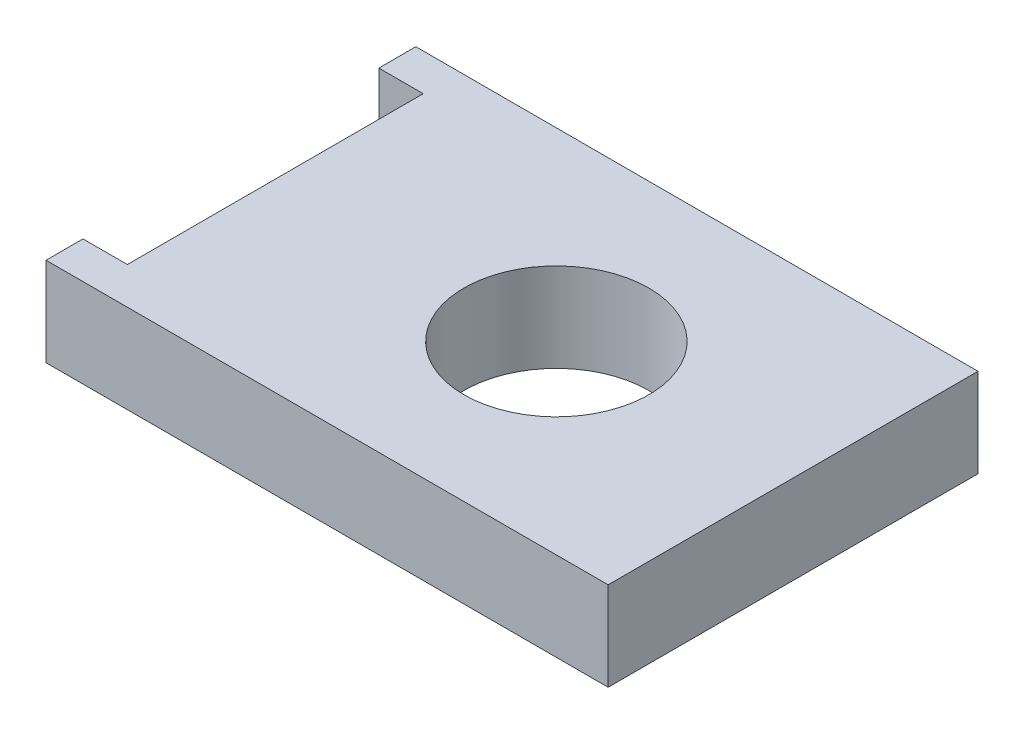
ISO-10303-21;
HEADER;
FILE_DESCRIPTION(('STEP AP214'),'2;1');
FILE_NAME('part.step','',(''),(''),'','','');
FILE_SCHEMA(('AUTOMOTIVE_DESIGN { 1 0 10303 214 1 1 1 1 }'));
ENDSEC;
DATA;
#1=APPLICATION_CONTEXT('core data for automotive mechanical design processes');
#2=APPLICATION_PROTOCOL_DEFINITION('international standard','automotive_design',2000,#1);
#3=PRODUCT_CONTEXT('',#1,'mechanical');
#4=PRODUCT('Part','Part','',(#3));
#5=PRODUCT_RELATED_PRODUCT_CATEGORY('part','',(#4));
#6=PRODUCT_DEFINITION_FORMATION('','',#4);
#7=PRODUCT_DEFINITION_CONTEXT('part definition',#1,'design');
#8=PRODUCT_DEFINITION('design','',#6,#7);
#9=PRODUCT_DEFINITION_SHAPE('','',#8);
#10=(LENGTH_UNIT() NAMED_UNIT(*) SI_UNIT(.MILLI.,.METRE.));
#11=(NAMED_UNIT(*) PLANE_ANGLE_UNIT() SI_UNIT($,.RADIAN.));
#12=(NAMED_UNIT(*) SI_UNIT($,.STERADIAN.) SOLID_ANGLE_UNIT());
#13=UNCERTAINTY_MEASURE_WITH_UNIT(LENGTH_MEASURE(1.E-05),#10,'distance_accuracy_value','');
#14=(GEOMETRIC_REPRESENTATION_CONTEXT(3) GLOBAL_UNCERTAINTY_ASSIGNED_CONTEXT((#13)) GLOBAL_UNIT_ASSIGNED_CONTEXT((#10,
#11,#12)) REPRESENTATION_CONTEXT('',''));
#15=CARTESIAN_POINT('',(0.,0.,0.));
#16=DIRECTION('',(0.,0.,1.));
#17=DIRECTION('',(1.,0.,0.));
#18=AXIS2_PLACEMENT_3D('',#15,#16,#17);
#19=CARTESIAN_POINT('',(0.,3.,0.));
#20=DIRECTION('',(0.,1.,0.));
#21=DIRECTION('',(0.,0.,1.));
#22=AXIS2_PLACEMENT_3D('',#19,#20,#21);
#23=PLANE('',#22);
#24=DIRECTION('',(0.,0.,1.));
#25=VECTOR('',#24,1.);
#26=CARTESIAN_POINT('',(-19.,3.,-10.));
#27=LINE('',#26,#25);
#28=CARTESIAN_POINT('',(-19.,3.,-12.5));
#29=VERTEX_POINT('',#28);
#30=CARTESIAN_POINT('',(-19.,3.,-10.));
#31=VERTEX_POINT('',#30);
#32=EDGE_CURVE('E170',#29,#31,#27,.T.);
#33=ORIENTED_EDGE('',*,*,#32,.T.);
#34=DIRECTION('',(1.,0.,0.));
#35=VECTOR('',#34,1.);
#36=CARTESIAN_POINT('',(-19.,3.,-10.));
#37=LINE('',#36,#35);
#38=CARTESIAN_POINT('',(-16.,3.,-10.));
#39=VERTEX_POINT('',#38);
#40=EDGE_CURVE('E106',#31,#39,#37,.T.);
#41=ORIENTED_EDGE('',*,*,#40,.T.);
#42=DIRECTION('',(0.,0.,1.));
#43=VECTOR('',#42,1.);
#44=CARTESIAN_POINT('',(-16.,3.,-10.));
#45=LINE('',#44,#43);
#46=CARTESIAN_POINT('',(-16.,3.,9.99999999999999));
#47=VERTEX_POINT('',#46);
#48=EDGE_CURVE('E191',#39,#47,#45,.T.);
#49=ORIENTED_EDGE('',*,*,#48,.T.);
#50=DIRECTION('',(-1.,0.,0.));
#51=VECTOR('',#50,1.);
#52=CARTESIAN_POINT('',(-16.,3.,9.99999999999999));
#53=LINE('',#52,#51);
#54=CARTESIAN_POINT('',(-19.,3.,9.99999999999999));
#55=VERTEX_POINT('',#54);
#56=EDGE_CURVE('E205',#47,#55,#53,.T.);
#57=ORIENTED_EDGE('',*,*,#56,.T.);
#58=DIRECTION('',(0.,0.,1.));
#59=VECTOR('',#58,1.);
#60=CARTESIAN_POINT('',(-19.,3.,12.5));
#61=LINE('',#60,#59);
#62=CARTESIAN_POINT('',(-19.,3.,12.5));
#63=VERTEX_POINT('',#62);
#64=EDGE_CURVE('E125',#55,#63,#61,.T.);
#65=ORIENTED_EDGE('',*,*,#64,.T.);
#66=DIRECTION('',(1.,0.,0.));
#67=VECTOR('',#66,1.);
#68=CARTESIAN_POINT('',(19.,3.,12.5));
#69=LINE('',#68,#67);
#70=CARTESIAN_POINT('',(19.,3.,12.5));
#71=VERTEX_POINT('',#70);
#72=EDGE_CURVE('E119',#63,#71,#69,.T.);
#73=ORIENTED_EDGE('',*,*,#72,.T.);
#74=DIRECTION('',(0.,0.,-1.));
#75=VECTOR('',#74,1.);
#76=CARTESIAN_POINT('',(19.,3.,12.5));
#77=LINE('',#76,#75);
#78=CARTESIAN_POINT('',(19.,3.,-12.5));
#79=VERTEX_POINT('',#78);
#80=EDGE_CURVE('E123',#71,#79,#77,.T.);
#81=ORIENTED_EDGE('',*,*,#80,.T.);
#82=DIRECTION('',(-1.,0.,0.));
#83=VECTOR('',#82,1.);
#84=CARTESIAN_POINT('',(19.,3.,-12.5));
#85=LINE('',#84,#83);
#86=EDGE_CURVE('E63',#79,#29,#85,.T.);
#87=ORIENTED_EDGE('',*,*,#86,.T.);
#88=EDGE_LOOP('',(#33,#41,#49,#57,#65,#73,#81,#87));
#89=FACE_BOUND('',#88,.T.);
#90=CARTESIAN_POINT('',(3.,3.,0.));
#91=DIRECTION('',(0.,1.,0.));
#92=DIRECTION('',(0.,0.,1.));
#93=AXIS2_PLACEMENT_3D('',#90,#91,#92);
#94=CIRCLE('',#93,6.25);
#95=CARTESIAN_POINT('',(3.,3.,6.24999999999999));
#96=VERTEX_POINT('',#95);
#97=EDGE_CURVE('E152',#96,#96,#94,.T.);
#98=ORIENTED_EDGE('',*,*,#97,.F.);
#99=EDGE_LOOP('',(#98));
#100=FACE_BOUND('',#99,.T.);
#101=ADVANCED_FACE('F45',(#89,#100),#23,.T.);
#102=CARTESIAN_POINT('',(0.,-3.,0.));
#103=DIRECTION('',(0.,1.,0.));
#104=DIRECTION('',(0.,0.,1.));
#105=AXIS2_PLACEMENT_3D('',#102,#103,#104);
#106=PLANE('',#105);
#107=DIRECTION('',(0.,0.,1.));
#108=VECTOR('',#107,1.);
#109=CARTESIAN_POINT('',(-19.,-3.,-10.));
#110=LINE('',#109,#108);
#111=CARTESIAN_POINT('',(-19.,-3.,-12.5));
#112=VERTEX_POINT('',#111);
#113=CARTESIAN_POINT('',(-19.,-3.,-10.));
#114=VERTEX_POINT('',#113);
#115=EDGE_CURVE('E147',#112,#114,#110,.T.);
#116=ORIENTED_EDGE('',*,*,#115,.F.);
#117=DIRECTION('',(-1.,0.,0.));
#118=VECTOR('',#117,1.);
#119=CARTESIAN_POINT('',(19.,-3.,-12.5));
#120=LINE('',#119,#118);
#121=CARTESIAN_POINT('',(19.,-3.,-12.5));
#122=VERTEX_POINT('',#121);
#123=EDGE_CURVE('E98',#122,#112,#120,.T.);
#124=ORIENTED_EDGE('',*,*,#123,.F.);
#125=DIRECTION('',(0.,0.,-1.));
#126=VECTOR('',#125,1.);
#127=CARTESIAN_POINT('',(19.,-3.,12.5));
#128=LINE('',#127,#126);
#129=CARTESIAN_POINT('',(19.,-3.,12.5));
#130=VERTEX_POINT('',#129);
#131=EDGE_CURVE('E92',#130,#122,#128,.T.);
#132=ORIENTED_EDGE('',*,*,#131,.F.);
#133=DIRECTION('',(1.,0.,0.));
#134=VECTOR('',#133,1.);
#135=CARTESIAN_POINT('',(19.,-3.,12.5));
#136=LINE('',#135,#134);
#137=CARTESIAN_POINT('',(-19.,-3.,12.5));
#138=VERTEX_POINT('',#137);
#139=EDGE_CURVE('E134',#138,#130,#136,.T.);
#140=ORIENTED_EDGE('',*,*,#139,.F.);
#141=DIRECTION('',(0.,0.,1.));
#142=VECTOR('',#141,1.);
#143=CARTESIAN_POINT('',(-19.,-3.,12.5));
#144=LINE('',#143,#142);
#145=CARTESIAN_POINT('',(-19.,-3.,9.99999999999999));
#146=VERTEX_POINT('',#145);
#147=EDGE_CURVE('E161',#146,#138,#144,.T.);
#148=ORIENTED_EDGE('',*,*,#147,.F.);
#149=DIRECTION('',(-1.,0.,0.));
#150=VECTOR('',#149,1.);
#151=CARTESIAN_POINT('',(-16.,-3.,9.99999999999999));
#152=LINE('',#151,#150);
#153=CARTESIAN_POINT('',(-16.,-3.,9.99999999999999));
#154=VERTEX_POINT('',#153);
#155=EDGE_CURVE('E158',#154,#146,#152,.T.);
#156=ORIENTED_EDGE('',*,*,#155,.F.);
#157=DIRECTION('',(0.,0.,1.));
#158=VECTOR('',#157,1.);
#159=CARTESIAN_POINT('',(-16.,-3.,-10.));
#160=LINE('',#159,#158);
#161=CARTESIAN_POINT('',(-16.,-3.,-10.));
#162=VERTEX_POINT('',#161);
#163=EDGE_CURVE('E155',#162,#154,#160,.T.);
#164=ORIENTED_EDGE('',*,*,#163,.F.);
#165=DIRECTION('',(1.,0.,0.));
#166=VECTOR('',#165,1.);
#167=CARTESIAN_POINT('',(-19.,-3.,-10.));
#168=LINE('',#167,#166);
#169=EDGE_CURVE('E151',#114,#162,#168,.T.);
#170=ORIENTED_EDGE('',*,*,#169,.F.);
#171=EDGE_LOOP('',(#116,#124,#132,#140,#148,#156,#164,#170));
#172=FACE_BOUND('',#171,.T.);
#173=CARTESIAN_POINT('',(3.,-3.,0.));
#174=DIRECTION('',(0.,1.,0.));
#175=DIRECTION('',(0.,0.,1.));
#176=AXIS2_PLACEMENT_3D('',#173,#174,#175);
#177=CIRCLE('',#176,6.25);
#178=CARTESIAN_POINT('',(3.,-3.,6.24999999999999));
#179=VERTEX_POINT('',#178);
#180=EDGE_CURVE('E215',#179,#179,#177,.T.);
#181=ORIENTED_EDGE('',*,*,#180,.T.);
#182=EDGE_LOOP('',(#181));
#183=FACE_BOUND('',#182,.T.);
#184=ADVANCED_FACE('F195',(#172,#183),#106,.F.);
#185=CARTESIAN_POINT('',(-19.,3.,-10.));
#186=DIRECTION('',(1.,0.,0.));
#187=DIRECTION('',(0.,0.,-1.));
#188=AXIS2_PLACEMENT_3D('',#185,#186,#187);
#189=PLANE('',#188);
#190=ORIENTED_EDGE('',*,*,#115,.T.);
#191=DIRECTION('',(0.,-1.,0.));
#192=VECTOR('',#191,1.);
#193=CARTESIAN_POINT('',(-19.,3.,-10.));
#194=LINE('',#193,#192);
#195=EDGE_CURVE('E11',#31,#114,#194,.T.);
#196=ORIENTED_EDGE('',*,*,#195,.F.);
#197=ORIENTED_EDGE('',*,*,#32,.F.);
#198=DIRECTION('',(0.,-1.,0.));
#199=VECTOR('',#198,1.);
#200=CARTESIAN_POINT('',(-19.,3.,-12.5));
#201=LINE('',#200,#199);
#202=EDGE_CURVE('E143',#29,#112,#201,.T.);
#203=ORIENTED_EDGE('',*,*,#202,.T.);
#204=EDGE_LOOP('',(#190,#196,#197,#203));
#205=FACE_BOUND('',#204,.T.);
#206=ADVANCED_FACE('F47',(#205),#189,.F.);
#207=CARTESIAN_POINT('',(-19.,3.,-10.));
#208=DIRECTION('',(0.,0.,-1.));
#209=DIRECTION('',(-1.,0.,0.));
#210=AXIS2_PLACEMENT_3D('',#207,#208,#209);
#211=PLANE('',#210);
#212=ORIENTED_EDGE('',*,*,#169,.T.);
#213=DIRECTION('',(0.,-1.,0.));
#214=VECTOR('',#213,1.);
#215=CARTESIAN_POINT('',(-16.,3.,-10.));
#216=LINE('',#215,#214);
#217=EDGE_CURVE('E55',#39,#162,#216,.T.);
#218=ORIENTED_EDGE('',*,*,#217,.F.);
#219=ORIENTED_EDGE('',*,*,#40,.F.);
#220=ORIENTED_EDGE('',*,*,#195,.T.);
#221=EDGE_LOOP('',(#212,#218,#219,#220));
#222=FACE_BOUND('',#221,.T.);
#223=ADVANCED_FACE('F245',(#222),#211,.F.);
#224=CARTESIAN_POINT('',(-16.,3.,-10.));
#225=DIRECTION('',(1.,0.,0.));
#226=DIRECTION('',(0.,0.,-1.));
#227=AXIS2_PLACEMENT_3D('',#224,#225,#226);
#228=PLANE('',#227);
#229=ORIENTED_EDGE('',*,*,#163,.T.);
#230=DIRECTION('',(0.,-1.,0.));
#231=VECTOR('',#230,1.);
#232=CARTESIAN_POINT('',(-16.,3.,9.99999999999999));
#233=LINE('',#232,#231);
#234=EDGE_CURVE('E181',#47,#154,#233,.T.);
#235=ORIENTED_EDGE('',*,*,#234,.F.);
#236=ORIENTED_EDGE('',*,*,#48,.F.);
#237=ORIENTED_EDGE('',*,*,#217,.T.);
#238=EDGE_LOOP('',(#229,#235,#236,#237));
#239=FACE_BOUND('',#238,.T.);
#240=ADVANCED_FACE('F189',(#239),#228,.F.);
#241=CARTESIAN_POINT('',(-16.,3.,9.99999999999999));
#242=DIRECTION('',(0.,0.,1.));
#243=DIRECTION('',(1.,0.,0.));
#244=AXIS2_PLACEMENT_3D('',#241,#242,#243);
#245=PLANE('',#244);
#246=ORIENTED_EDGE('',*,*,#155,.T.);
#247=DIRECTION('',(0.,-1.,0.));
#248=VECTOR('',#247,1.);
#249=CARTESIAN_POINT('',(-19.,3.,9.99999999999999));
#250=LINE('',#249,#248);
#251=EDGE_CURVE('E177',#55,#146,#250,.T.);
#252=ORIENTED_EDGE('',*,*,#251,.F.);
#253=ORIENTED_EDGE('',*,*,#56,.F.);
#254=ORIENTED_EDGE('',*,*,#234,.T.);
#255=EDGE_LOOP('',(#246,#252,#253,#254));
#256=FACE_BOUND('',#255,.T.);
#257=ADVANCED_FACE('F200',(#256),#245,.F.);
#258=CARTESIAN_POINT('',(-19.,3.,12.5));
#259=DIRECTION('',(1.,0.,0.));
#260=DIRECTION('',(0.,0.,-1.));
#261=AXIS2_PLACEMENT_3D('',#258,#259,#260);
#262=PLANE('',#261);
#263=ORIENTED_EDGE('',*,*,#147,.T.);
#264=DIRECTION('',(0.,-1.,0.));
#265=VECTOR('',#264,1.);
#266=CARTESIAN_POINT('',(-19.,3.,12.5));
#267=LINE('',#266,#265);
#268=EDGE_CURVE('E136',#63,#138,#267,.T.);
#269=ORIENTED_EDGE('',*,*,#268,.F.);
#270=ORIENTED_EDGE('',*,*,#64,.F.);
#271=ORIENTED_EDGE('',*,*,#251,.T.);
#272=EDGE_LOOP('',(#263,#269,#270,#271));
#273=FACE_BOUND('',#272,.T.);
#274=ADVANCED_FACE('F203',(#273),#262,.F.);
#275=CARTESIAN_POINT('',(19.,3.,12.5));
#276=DIRECTION('',(0.,0.,-1.));
#277=DIRECTION('',(-1.,0.,0.));
#278=AXIS2_PLACEMENT_3D('',#275,#276,#277);
#279=PLANE('',#278);
#280=ORIENTED_EDGE('',*,*,#139,.T.);
#281=DIRECTION('',(0.,-1.,0.));
#282=VECTOR('',#281,1.);
#283=CARTESIAN_POINT('',(19.,3.,12.5));
#284=LINE('',#283,#282);
#285=EDGE_CURVE('E131',#71,#130,#284,.T.);
#286=ORIENTED_EDGE('',*,*,#285,.F.);
#287=ORIENTED_EDGE('',*,*,#72,.F.);
#288=ORIENTED_EDGE('',*,*,#268,.T.);
#289=EDGE_LOOP('',(#280,#286,#287,#288));
#290=FACE_BOUND('',#289,.T.);
#291=ADVANCED_FACE('F132',(#290),#279,.F.);
#292=CARTESIAN_POINT('',(19.,3.,12.5));
#293=DIRECTION('',(-1.,0.,0.));
#294=DIRECTION('',(0.,0.,1.));
#295=AXIS2_PLACEMENT_3D('',#292,#293,#294);
#296=PLANE('',#295);
#297=ORIENTED_EDGE('',*,*,#131,.T.);
#298=DIRECTION('',(0.,-1.,0.));
#299=VECTOR('',#298,1.);
#300=CARTESIAN_POINT('',(19.,3.,-12.5));
#301=LINE('',#300,#299);
#302=EDGE_CURVE('E137',#79,#122,#301,.T.);
#303=ORIENTED_EDGE('',*,*,#302,.F.);
#304=ORIENTED_EDGE('',*,*,#80,.F.);
#305=ORIENTED_EDGE('',*,*,#285,.T.);
#306=EDGE_LOOP('',(#297,#303,#304,#305));
#307=FACE_BOUND('',#306,.T.);
#308=ADVANCED_FACE('F139',(#307),#296,.F.);
#309=CARTESIAN_POINT('',(19.,3.,-12.5));
#310=DIRECTION('',(0.,0.,1.));
#311=DIRECTION('',(1.,0.,0.));
#312=AXIS2_PLACEMENT_3D('',#309,#310,#311);
#313=PLANE('',#312);
#314=ORIENTED_EDGE('',*,*,#123,.T.);
#315=ORIENTED_EDGE('',*,*,#202,.F.);
#316=ORIENTED_EDGE('',*,*,#86,.F.);
#317=ORIENTED_EDGE('',*,*,#302,.T.);
#318=EDGE_LOOP('',(#314,#315,#316,#317));
#319=FACE_BOUND('',#318,.T.);
#320=ADVANCED_FACE('F233',(#319),#313,.F.);
#321=CARTESIAN_POINT('',(3.,3.,0.));
#322=DIRECTION('',(0.,-1.,0.));
#323=DIRECTION('',(0.,0.,-1.));
#324=AXIS2_PLACEMENT_3D('',#321,#322,#323);
#325=CYLINDRICAL_SURFACE('',#324,6.25);
#326=ORIENTED_EDGE('',*,*,#97,.T.);
#327=EDGE_LOOP('',(#326));
#328=FACE_BOUND('',#327,.T.);
#329=ORIENTED_EDGE('',*,*,#180,.F.);
#330=EDGE_LOOP('',(#329));
#331=FACE_BOUND('',#330,.T.);
#332=ADVANCED_FACE('F223',(#328,#331),#325,.F.);
#333=CLOSED_SHELL('',(#101,#184,#206,#223,#240,#257,#274,#291,#308,#320,#332));
#334=MANIFOLD_SOLID_BREP('B2',#333);
#335=ADVANCED_BREP_SHAPE_REPRESENTATION('',(#18,#334),#14);
#336=SHAPE_DEFINITION_REPRESENTATION(#9,#335);
ENDSEC;
END-ISO-10303-21;
